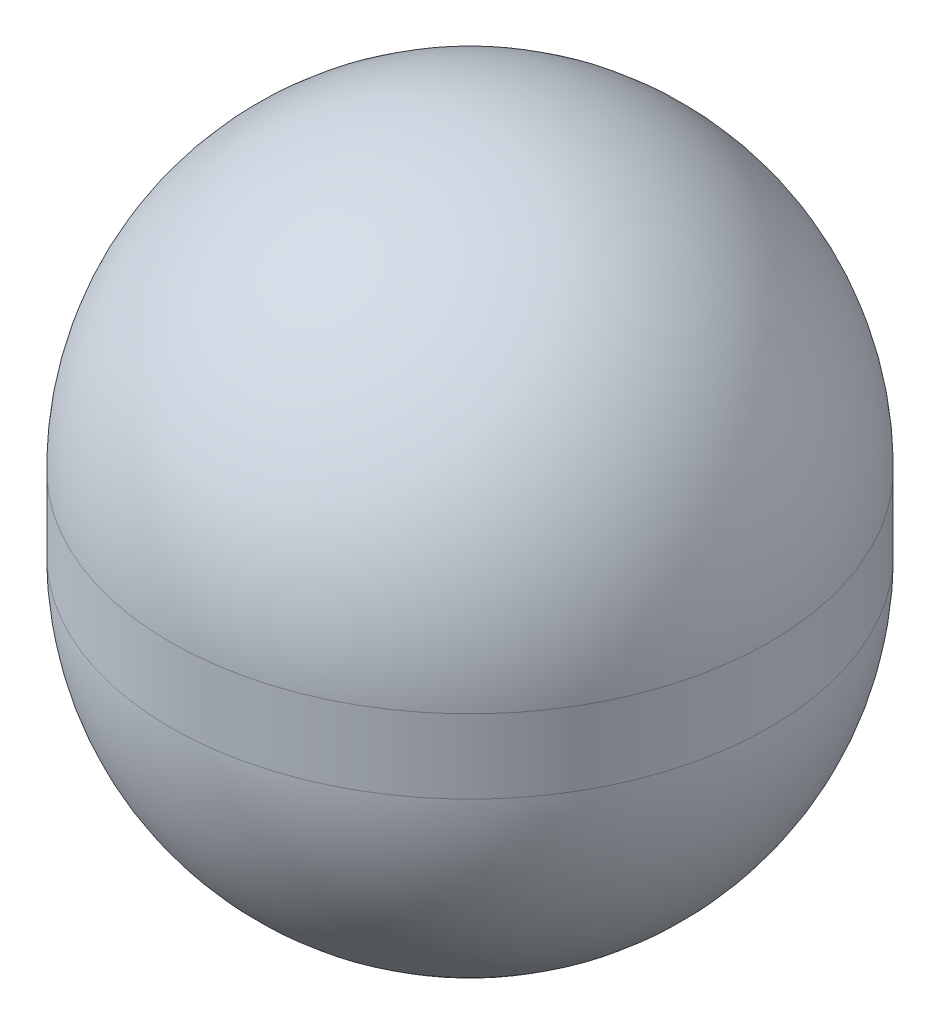
ISO-10303-21;
HEADER;
FILE_DESCRIPTION(('STEP AP214'),'2;1');
FILE_NAME('part.step','',(''),(''),'','','');
FILE_SCHEMA(('AUTOMOTIVE_DESIGN { 1 0 10303 214 1 1 1 1 }'));
ENDSEC;
DATA;
#1=APPLICATION_CONTEXT('core data for automotive mechanical design processes');
#2=APPLICATION_PROTOCOL_DEFINITION('international standard','automotive_design',2000,#1);
#3=PRODUCT_CONTEXT('',#1,'mechanical');
#4=PRODUCT('Part','Part','',(#3));
#5=PRODUCT_RELATED_PRODUCT_CATEGORY('part','',(#4));
#6=PRODUCT_DEFINITION_FORMATION('','',#4);
#7=PRODUCT_DEFINITION_CONTEXT('part definition',#1,'design');
#8=PRODUCT_DEFINITION('design','',#6,#7);
#9=PRODUCT_DEFINITION_SHAPE('','',#8);
#10=(LENGTH_UNIT() NAMED_UNIT(*) SI_UNIT(.MILLI.,.METRE.));
#11=(NAMED_UNIT(*) PLANE_ANGLE_UNIT() SI_UNIT($,.RADIAN.));
#12=(NAMED_UNIT(*) SI_UNIT($,.STERADIAN.) SOLID_ANGLE_UNIT());
#13=UNCERTAINTY_MEASURE_WITH_UNIT(LENGTH_MEASURE(1.E-05),#10,'distance_accuracy_value','');
#14=(GEOMETRIC_REPRESENTATION_CONTEXT(3) GLOBAL_UNCERTAINTY_ASSIGNED_CONTEXT((#13)) GLOBAL_UNIT_ASSIGNED_CONTEXT((#10,
#11,#12)) REPRESENTATION_CONTEXT('',''));
#15=CARTESIAN_POINT('',(0.,0.,0.));
#16=DIRECTION('',(0.,0.,1.));
#17=DIRECTION('',(1.,0.,0.));
#18=AXIS2_PLACEMENT_3D('',#15,#16,#17);
#19=CARTESIAN_POINT('',(0.,7.62,0.));
#20=DIRECTION('',(0.,-1.,0.));
#21=DIRECTION('',(1.,0.,0.));
#22=AXIS2_PLACEMENT_3D('',#19,#20,#21);
#23=CYLINDRICAL_SURFACE('',#22,30.8979721450186);
#24=CARTESIAN_POINT('',(0.,7.62,0.));
#25=DIRECTION('',(0.,1.,0.));
#26=DIRECTION('',(-1.,0.,0.));
#27=AXIS2_PLACEMENT_3D('',#24,#25,#26);
#28=CIRCLE('',#27,30.8979721450186);
#29=CARTESIAN_POINT('',(30.8979721450186,7.61999999999978,0.));
#30=VERTEX_POINT('',#29);
#31=EDGE_CURVE('E10',#30,#30,#28,.T.);
#32=CARTESIAN_POINT('',(0.,0.,0.));
#33=DIRECTION('',(0.,1.,0.));
#34=DIRECTION('',(-1.,0.,0.));
#35=AXIS2_PLACEMENT_3D('',#32,#33,#34);
#36=CIRCLE('',#35,30.8979721450186);
#37=CARTESIAN_POINT('',(30.8979721450186,-2.15973072759112E-13,0.));
#38=VERTEX_POINT('',#37);
#39=EDGE_CURVE('E35',#38,#38,#36,.T.);
#40=CARTESIAN_POINT('',(30.8979721450186,7.61999999999978,0.));
#41=CARTESIAN_POINT('',(30.8979721450186,7.54062499999978,0.));
#42=CARTESIAN_POINT('',(30.8979721450186,7.46124999999978,0.));
#43=CARTESIAN_POINT('',(30.8979721450186,7.30249999999978,0.));
#44=CARTESIAN_POINT('',(30.8979721450186,7.22312499999978,0.));
#45=CARTESIAN_POINT('',(30.8979721450186,7.06437499999978,0.));
#46=CARTESIAN_POINT('',(30.8979721450186,6.98499999999978,0.));
#47=CARTESIAN_POINT('',(30.8979721450186,6.82624999999978,0.));
#48=CARTESIAN_POINT('',(30.8979721450186,6.74687499999978,0.));
#49=CARTESIAN_POINT('',(30.8979721450186,6.58812499999978,0.));
#50=CARTESIAN_POINT('',(30.8979721450186,6.50874999999978,0.));
#51=CARTESIAN_POINT('',(30.8979721450186,6.34999999999978,0.));
#52=CARTESIAN_POINT('',(30.8979721450186,6.27062499999978,0.));
#53=CARTESIAN_POINT('',(30.8979721450186,6.11187499999978,0.));
#54=CARTESIAN_POINT('',(30.8979721450186,6.03249999999978,0.));
#55=CARTESIAN_POINT('',(30.8979721450186,5.87374999999978,0.));
#56=CARTESIAN_POINT('',(30.8979721450186,5.79437499999978,0.));
#57=CARTESIAN_POINT('',(30.8979721450186,5.63562499999978,0.));
#58=CARTESIAN_POINT('',(30.8979721450186,5.55624999999978,0.));
#59=CARTESIAN_POINT('',(30.8979721450186,5.39749999999978,0.));
#60=CARTESIAN_POINT('',(30.8979721450186,5.31812499999978,0.));
#61=CARTESIAN_POINT('',(30.8979721450186,5.15937499999978,0.));
#62=CARTESIAN_POINT('',(30.8979721450186,5.07999999999978,0.));
#63=CARTESIAN_POINT('',(30.8979721450186,4.92124999999978,0.));
#64=CARTESIAN_POINT('',(30.8979721450186,4.84187499999978,0.));
#65=CARTESIAN_POINT('',(30.8979721450186,4.68312499999978,0.));
#66=CARTESIAN_POINT('',(30.8979721450186,4.60374999999978,0.));
#67=CARTESIAN_POINT('',(30.8979721450186,4.44499999999978,0.));
#68=CARTESIAN_POINT('',(30.8979721450186,4.36562499999978,0.));
#69=CARTESIAN_POINT('',(30.8979721450186,4.20687499999978,0.));
#70=CARTESIAN_POINT('',(30.8979721450186,4.12749999999978,0.));
#71=CARTESIAN_POINT('',(30.8979721450186,3.96874999999978,0.));
#72=CARTESIAN_POINT('',(30.8979721450186,3.88937499999978,0.));
#73=CARTESIAN_POINT('',(30.8979721450186,3.73062499999978,0.));
#74=CARTESIAN_POINT('',(30.8979721450186,3.65124999999978,0.));
#75=CARTESIAN_POINT('',(30.8979721450186,3.49249999999978,0.));
#76=CARTESIAN_POINT('',(30.8979721450186,3.41312499999978,0.));
#77=CARTESIAN_POINT('',(30.8979721450186,3.25437499999978,0.));
#78=CARTESIAN_POINT('',(30.8979721450186,3.17499999999978,0.));
#79=CARTESIAN_POINT('',(30.8979721450186,3.01624999999978,0.));
#80=CARTESIAN_POINT('',(30.8979721450186,2.93687499999978,0.));
#81=CARTESIAN_POINT('',(30.8979721450186,2.77812499999978,0.));
#82=CARTESIAN_POINT('',(30.8979721450186,2.69874999999978,0.));
#83=CARTESIAN_POINT('',(30.8979721450186,2.53999999999978,0.));
#84=CARTESIAN_POINT('',(30.8979721450186,2.46062499999978,0.));
#85=CARTESIAN_POINT('',(30.8979721450186,2.30187499999978,0.));
#86=CARTESIAN_POINT('',(30.8979721450186,2.22249999999978,0.));
#87=CARTESIAN_POINT('',(30.8979721450186,2.06374999999978,0.));
#88=CARTESIAN_POINT('',(30.8979721450186,1.98437499999978,0.));
#89=CARTESIAN_POINT('',(30.8979721450186,1.82562499999978,0.));
#90=CARTESIAN_POINT('',(30.8979721450186,1.74624999999978,0.));
#91=CARTESIAN_POINT('',(30.8979721450186,1.58749999999978,0.));
#92=CARTESIAN_POINT('',(30.8979721450186,1.50812499999978,0.));
#93=CARTESIAN_POINT('',(30.8979721450186,1.34937499999978,0.));
#94=CARTESIAN_POINT('',(30.8979721450186,1.26999999999978,0.));
#95=CARTESIAN_POINT('',(30.8979721450186,1.11124999999978,0.));
#96=CARTESIAN_POINT('',(30.8979721450186,1.03187499999978,0.));
#97=CARTESIAN_POINT('',(30.8979721450186,0.873124999999784,0.));
#98=CARTESIAN_POINT('',(30.8979721450186,0.793749999999784,0.));
#99=CARTESIAN_POINT('',(30.8979721450186,0.634999999999784,0.));
#100=CARTESIAN_POINT('',(30.8979721450186,0.555624999999784,0.));
#101=CARTESIAN_POINT('',(30.8979721450186,0.396874999999784,0.));
#102=CARTESIAN_POINT('',(30.8979721450186,0.317499999999784,0.));
#103=CARTESIAN_POINT('',(30.8979721450186,0.158749999999784,0.));
#104=CARTESIAN_POINT('',(30.8979721450186,0.0793749999997839,0.));
#105=CARTESIAN_POINT('',(30.8979721450186,-2.15973072759112E-13,0.));
#106=B_SPLINE_CURVE_WITH_KNOTS('',3,(#40,#41,#42,#43,#44,#45,#46,#47,#48,#49,#50,#51,#52,#53,
#54,#55,#56,#57,#58,#59,#60,#61,#62,#63,#64,#65,#66,#67,#68,#69,#70,#71,#72,#73,#74,#75,#76,#77,
#78,#79,#80,#81,#82,#83,#84,#85,#86,#87,#88,#89,#90,#91,#92,#93,#94,#95,#96,#97,#98,#99,#100,
#101,#102,#103,#104,#105),.UNSPECIFIED.,.F.,.F.,(4,2,2,2,2,2,2,2,2,2,2,2,2,2,2,2,2,2,2,2,2,2,2,
2,2,2,2,2,2,2,2,2,4),(0.,0.238125,0.476249999999999,0.714375,0.952499999999999,1.190625,1.42875,
1.666875,1.905,2.143125,2.38125,2.619375,2.8575,3.095625,3.33375,3.571875,3.81,4.048125,4.28625,
4.524375,4.7625,5.000625,5.23875,5.476875,5.715,5.953125,6.19125,6.429375,6.6675,6.905625,
7.14375,7.381875,7.62),.UNSPECIFIED.);
#107=EDGE_CURVE('BSEAM31',#30,#38,#106,.T.);
#108=ORIENTED_EDGE('',*,*,#31,.F.);
#109=ORIENTED_EDGE('',*,*,#39,.T.);
#110=ORIENTED_EDGE('',*,*,#107,.T.);
#111=ORIENTED_EDGE('',*,*,#107,.F.);
#112=EDGE_LOOP('',(#108,#110,#109,#111));
#113=FACE_BOUND('',#112,.T.);
#114=ADVANCED_FACE('F31',(#113),#23,.T.);
#115=CARTESIAN_POINT('',(0.,0.,0.));
#116=DIRECTION('',(0.,0.,1.));
#117=DIRECTION('',(1.,0.,0.));
#118=AXIS2_PLACEMENT_3D('',#115,#116,#117);
#119=SPHERICAL_SURFACE('',#118,30.8979721450186);
#120=CARTESIAN_POINT('',(0.,0.,0.));
#121=DIRECTION('',(0.,1.,0.));
#122=DIRECTION('',(-1.,0.,0.));
#123=AXIS2_PLACEMENT_3D('',#120,#121,#122);
#124=SPHERICAL_SURFACE('',#123,30.8979721450186);
#125=ORIENTED_EDGE('',*,*,#39,.F.);
#126=EDGE_LOOP('',(#125));
#127=FACE_BOUND('',#126,.T.);
#128=ADVANCED_FACE('F33',(#127),#124,.T.);
#129=CARTESIAN_POINT('',(0.,7.62,0.));
#130=DIRECTION('',(0.,0.,-1.));
#131=DIRECTION('',(-1.,0.,0.));
#132=AXIS2_PLACEMENT_3D('',#129,#130,#131);
#133=SPHERICAL_SURFACE('',#132,30.8979721450186);
#134=CARTESIAN_POINT('',(0.,7.62,0.));
#135=DIRECTION('',(0.,1.,0.));
#136=DIRECTION('',(-1.,0.,0.));
#137=AXIS2_PLACEMENT_3D('',#134,#135,#136);
#138=SPHERICAL_SURFACE('',#137,30.8979721450186);
#139=ORIENTED_EDGE('',*,*,#31,.T.);
#140=EDGE_LOOP('',(#139));
#141=FACE_BOUND('',#140,.T.);
#142=ADVANCED_FACE('F46',(#141),#138,.T.);
#143=CLOSED_SHELL('',(#114,#128,#142));
#144=MANIFOLD_SOLID_BREP('B2',#143);
#145=ADVANCED_BREP_SHAPE_REPRESENTATION('',(#18,#144),#14);
#146=SHAPE_DEFINITION_REPRESENTATION(#9,#145);
ENDSEC;
END-ISO-10303-21;
